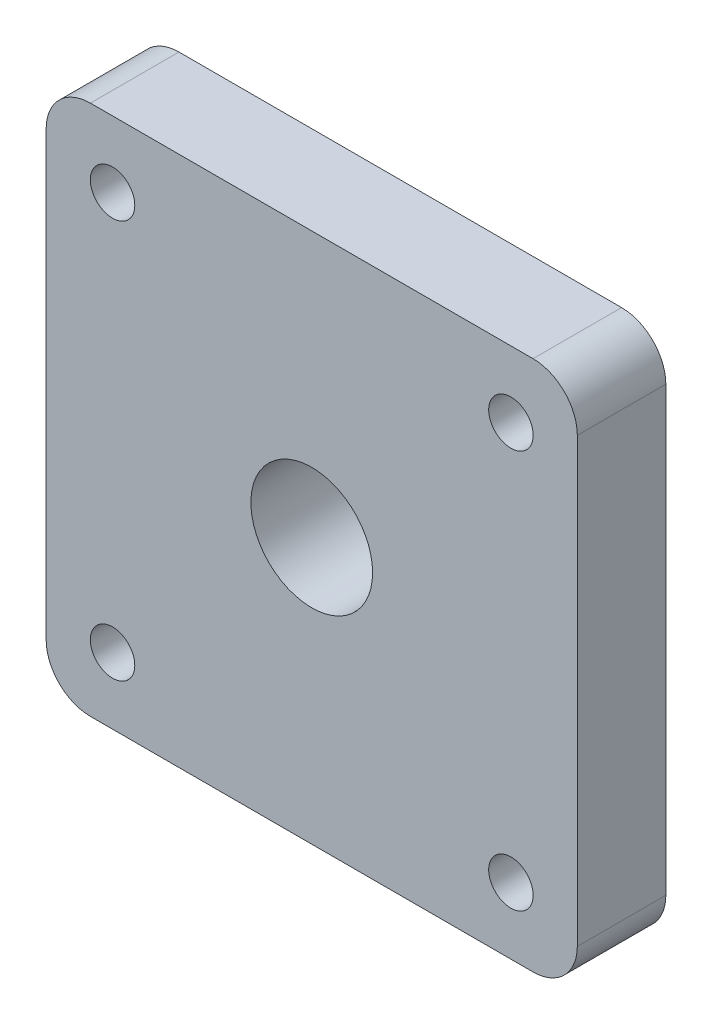
ISO-10303-21;
HEADER;
FILE_DESCRIPTION(('STEP AP214'),'2;1');
FILE_NAME('part.step','',(''),(''),'','','');
FILE_SCHEMA(('AUTOMOTIVE_DESIGN { 1 0 10303 214 1 1 1 1 }'));
ENDSEC;
DATA;
#1=APPLICATION_CONTEXT('core data for automotive mechanical design processes');
#2=APPLICATION_PROTOCOL_DEFINITION('international standard','automotive_design',2000,#1);
#3=PRODUCT_CONTEXT('',#1,'mechanical');
#4=PRODUCT('Part','Part','',(#3));
#5=PRODUCT_RELATED_PRODUCT_CATEGORY('part','',(#4));
#6=PRODUCT_DEFINITION_FORMATION('','',#4);
#7=PRODUCT_DEFINITION_CONTEXT('part definition',#1,'design');
#8=PRODUCT_DEFINITION('design','',#6,#7);
#9=PRODUCT_DEFINITION_SHAPE('','',#8);
#10=(LENGTH_UNIT() NAMED_UNIT(*) SI_UNIT(.MILLI.,.METRE.));
#11=(NAMED_UNIT(*) PLANE_ANGLE_UNIT() SI_UNIT($,.RADIAN.));
#12=(NAMED_UNIT(*) SI_UNIT($,.STERADIAN.) SOLID_ANGLE_UNIT());
#13=UNCERTAINTY_MEASURE_WITH_UNIT(LENGTH_MEASURE(1.E-05),#10,'distance_accuracy_value','');
#14=(GEOMETRIC_REPRESENTATION_CONTEXT(3) GLOBAL_UNCERTAINTY_ASSIGNED_CONTEXT((#13)) GLOBAL_UNIT_ASSIGNED_CONTEXT((#10,
#11,#12)) REPRESENTATION_CONTEXT('',''));
#15=CARTESIAN_POINT('',(0.,0.,0.));
#16=DIRECTION('',(0.,0.,1.));
#17=DIRECTION('',(1.,0.,0.));
#18=AXIS2_PLACEMENT_3D('',#15,#16,#17);
#19=CARTESIAN_POINT('',(-20.955,-20.955,10.541));
#20=DIRECTION('',(0.,0.,1.));
#21=DIRECTION('',(1.,0.,0.));
#22=AXIS2_PLACEMENT_3D('',#19,#20,#21);
#23=PLANE('',#22);
#24=CARTESIAN_POINT('',(18.8595,-18.8595,10.541));
#25=DIRECTION('',(0.,0.,1.));
#26=DIRECTION('',(1.,0.,0.));
#27=AXIS2_PLACEMENT_3D('',#24,#25,#26);
#28=CIRCLE('',#27,2.103882);
#29=CARTESIAN_POINT('',(20.963382,-18.8595,10.541));
#30=VERTEX_POINT('',#29);
#31=EDGE_CURVE('E228',#30,#30,#28,.T.);
#32=ORIENTED_EDGE('',*,*,#31,.F.);
#33=EDGE_LOOP('',(#32));
#34=FACE_BOUND('',#33,.T.);
#35=CARTESIAN_POINT('',(-18.8595,18.8595,10.541));
#36=DIRECTION('',(0.,0.,1.));
#37=DIRECTION('',(1.,0.,0.));
#38=AXIS2_PLACEMENT_3D('',#35,#36,#37);
#39=CIRCLE('',#38,2.103882);
#40=CARTESIAN_POINT('',(-16.755618,18.8595,10.541));
#41=VERTEX_POINT('',#40);
#42=EDGE_CURVE('E212',#41,#41,#39,.T.);
#43=ORIENTED_EDGE('',*,*,#42,.F.);
#44=EDGE_LOOP('',(#43));
#45=FACE_BOUND('',#44,.T.);
#46=CARTESIAN_POINT('',(-20.955,-20.955,10.541));
#47=DIRECTION('',(0.,0.,1.));
#48=DIRECTION('',(1.,0.,0.));
#49=AXIS2_PLACEMENT_3D('',#46,#47,#48);
#50=CIRCLE('',#49,4.191);
#51=CARTESIAN_POINT('',(-25.146,-20.955,10.541));
#52=VERTEX_POINT('',#51);
#53=CARTESIAN_POINT('',(-20.955,-25.146,10.541));
#54=VERTEX_POINT('',#53);
#55=EDGE_CURVE('E163',#52,#54,#50,.T.);
#56=ORIENTED_EDGE('',*,*,#55,.T.);
#57=DIRECTION('',(1.,0.,0.));
#58=VECTOR('',#57,1.);
#59=CARTESIAN_POINT('',(-20.955,-25.146,10.541));
#60=LINE('',#59,#58);
#61=CARTESIAN_POINT('',(20.955,-25.146,10.541));
#62=VERTEX_POINT('',#61);
#63=EDGE_CURVE('E99',#54,#62,#60,.T.);
#64=ORIENTED_EDGE('',*,*,#63,.T.);
#65=CARTESIAN_POINT('',(20.955,-20.955,10.541));
#66=DIRECTION('',(0.,0.,1.));
#67=DIRECTION('',(1.,0.,0.));
#68=AXIS2_PLACEMENT_3D('',#65,#66,#67);
#69=CIRCLE('',#68,4.191);
#70=CARTESIAN_POINT('',(25.146,-20.955,10.541));
#71=VERTEX_POINT('',#70);
#72=EDGE_CURVE('E184',#62,#71,#69,.T.);
#73=ORIENTED_EDGE('',*,*,#72,.T.);
#74=DIRECTION('',(0.,1.,0.));
#75=VECTOR('',#74,1.);
#76=CARTESIAN_POINT('',(25.146,20.955,10.541));
#77=LINE('',#76,#75);
#78=CARTESIAN_POINT('',(25.146,20.955,10.541));
#79=VERTEX_POINT('',#78);
#80=EDGE_CURVE('E198',#71,#79,#77,.T.);
#81=ORIENTED_EDGE('',*,*,#80,.T.);
#82=CARTESIAN_POINT('',(20.955,20.955,10.541));
#83=DIRECTION('',(0.,0.,1.));
#84=DIRECTION('',(-1.,0.,0.));
#85=AXIS2_PLACEMENT_3D('',#82,#83,#84);
#86=CIRCLE('',#85,4.191);
#87=CARTESIAN_POINT('',(20.955,25.146,10.541));
#88=VERTEX_POINT('',#87);
#89=EDGE_CURVE('E118',#79,#88,#86,.T.);
#90=ORIENTED_EDGE('',*,*,#89,.T.);
#91=DIRECTION('',(-1.,0.,0.));
#92=VECTOR('',#91,1.);
#93=CARTESIAN_POINT('',(-20.955,25.146,10.541));
#94=LINE('',#93,#92);
#95=CARTESIAN_POINT('',(-20.955,25.146,10.541));
#96=VERTEX_POINT('',#95);
#97=EDGE_CURVE('E112',#88,#96,#94,.T.);
#98=ORIENTED_EDGE('',*,*,#97,.T.);
#99=CARTESIAN_POINT('',(-20.955,20.955,10.541));
#100=DIRECTION('',(0.,0.,1.));
#101=DIRECTION('',(1.,0.,0.));
#102=AXIS2_PLACEMENT_3D('',#99,#100,#101);
#103=CIRCLE('',#102,4.191);
#104=CARTESIAN_POINT('',(-25.146,20.955,10.541));
#105=VERTEX_POINT('',#104);
#106=EDGE_CURVE('E116',#96,#105,#103,.T.);
#107=ORIENTED_EDGE('',*,*,#106,.T.);
#108=DIRECTION('',(0.,-1.,0.));
#109=VECTOR('',#108,1.);
#110=CARTESIAN_POINT('',(-25.146,20.955,10.541));
#111=LINE('',#110,#109);
#112=EDGE_CURVE('E56',#105,#52,#111,.T.);
#113=ORIENTED_EDGE('',*,*,#112,.T.);
#114=EDGE_LOOP('',(#56,#64,#73,#81,#90,#98,#107,#113));
#115=FACE_BOUND('',#114,.T.);
#116=CARTESIAN_POINT('',(0.,0.,10.541));
#117=DIRECTION('',(0.,0.,1.));
#118=DIRECTION('',(1.,0.,0.));
#119=AXIS2_PLACEMENT_3D('',#116,#117,#118);
#120=CIRCLE('',#119,5.762625);
#121=CARTESIAN_POINT('',(5.762625,0.,10.541));
#122=VERTEX_POINT('',#121);
#123=EDGE_CURVE('E145',#122,#122,#120,.T.);
#124=ORIENTED_EDGE('',*,*,#123,.F.);
#125=EDGE_LOOP('',(#124));
#126=FACE_BOUND('',#125,.T.);
#127=CARTESIAN_POINT('',(18.8595,18.8595,10.541));
#128=DIRECTION('',(0.,0.,1.));
#129=DIRECTION('',(1.,0.,0.));
#130=AXIS2_PLACEMENT_3D('',#127,#128,#129);
#131=CIRCLE('',#130,2.103882);
#132=CARTESIAN_POINT('',(20.963382,18.8595,10.541));
#133=VERTEX_POINT('',#132);
#134=EDGE_CURVE('E220',#133,#133,#131,.T.);
#135=ORIENTED_EDGE('',*,*,#134,.F.);
#136=EDGE_LOOP('',(#135));
#137=FACE_BOUND('',#136,.T.);
#138=CARTESIAN_POINT('',(-18.8595,-18.8595,10.541));
#139=DIRECTION('',(0.,0.,1.));
#140=DIRECTION('',(1.,0.,0.));
#141=AXIS2_PLACEMENT_3D('',#138,#139,#140);
#142=CIRCLE('',#141,2.103882);
#143=CARTESIAN_POINT('',(-16.755618,-18.8595,10.541));
#144=VERTEX_POINT('',#143);
#145=EDGE_CURVE('E236',#144,#144,#142,.T.);
#146=ORIENTED_EDGE('',*,*,#145,.F.);
#147=EDGE_LOOP('',(#146));
#148=FACE_BOUND('',#147,.T.);
#149=ADVANCED_FACE('F38',(#34,#45,#115,#126,#137,#148),#23,.T.);
#150=CARTESIAN_POINT('',(-20.955,-20.955,2.159));
#151=DIRECTION('',(0.,0.,1.));
#152=DIRECTION('',(1.,0.,0.));
#153=AXIS2_PLACEMENT_3D('',#150,#151,#152);
#154=PLANE('',#153);
#155=CARTESIAN_POINT('',(-20.955,-20.955,2.159));
#156=DIRECTION('',(0.,0.,1.));
#157=DIRECTION('',(1.,0.,0.));
#158=AXIS2_PLACEMENT_3D('',#155,#156,#157);
#159=CIRCLE('',#158,4.191);
#160=CARTESIAN_POINT('',(-25.146,-20.955,2.159));
#161=VERTEX_POINT('',#160);
#162=CARTESIAN_POINT('',(-20.955,-25.146,2.159));
#163=VERTEX_POINT('',#162);
#164=EDGE_CURVE('E140',#161,#163,#159,.T.);
#165=ORIENTED_EDGE('',*,*,#164,.F.);
#166=DIRECTION('',(0.,-1.,0.));
#167=VECTOR('',#166,1.);
#168=CARTESIAN_POINT('',(-25.146,20.955,2.159));
#169=LINE('',#168,#167);
#170=CARTESIAN_POINT('',(-25.146,20.955,2.159));
#171=VERTEX_POINT('',#170);
#172=EDGE_CURVE('E91',#171,#161,#169,.T.);
#173=ORIENTED_EDGE('',*,*,#172,.F.);
#174=CARTESIAN_POINT('',(-20.955,20.955,2.159));
#175=DIRECTION('',(0.,0.,1.));
#176=DIRECTION('',(1.,0.,0.));
#177=AXIS2_PLACEMENT_3D('',#174,#175,#176);
#178=CIRCLE('',#177,4.191);
#179=CARTESIAN_POINT('',(-20.955,25.146,2.159));
#180=VERTEX_POINT('',#179);
#181=EDGE_CURVE('E85',#180,#171,#178,.T.);
#182=ORIENTED_EDGE('',*,*,#181,.F.);
#183=DIRECTION('',(-1.,0.,0.));
#184=VECTOR('',#183,1.);
#185=CARTESIAN_POINT('',(-20.955,25.146,2.159));
#186=LINE('',#185,#184);
#187=CARTESIAN_POINT('',(20.955,25.146,2.159));
#188=VERTEX_POINT('',#187);
#189=EDGE_CURVE('E127',#188,#180,#186,.T.);
#190=ORIENTED_EDGE('',*,*,#189,.F.);
#191=CARTESIAN_POINT('',(20.955,20.955,2.159));
#192=DIRECTION('',(0.,0.,1.));
#193=DIRECTION('',(-1.,0.,0.));
#194=AXIS2_PLACEMENT_3D('',#191,#192,#193);
#195=CIRCLE('',#194,4.191);
#196=CARTESIAN_POINT('',(25.146,20.955,2.159));
#197=VERTEX_POINT('',#196);
#198=EDGE_CURVE('E154',#197,#188,#195,.T.);
#199=ORIENTED_EDGE('',*,*,#198,.F.);
#200=DIRECTION('',(0.,1.,0.));
#201=VECTOR('',#200,1.);
#202=CARTESIAN_POINT('',(25.146,20.955,2.159));
#203=LINE('',#202,#201);
#204=CARTESIAN_POINT('',(25.146,-20.955,2.159));
#205=VERTEX_POINT('',#204);
#206=EDGE_CURVE('E151',#205,#197,#203,.T.);
#207=ORIENTED_EDGE('',*,*,#206,.F.);
#208=CARTESIAN_POINT('',(20.955,-20.955,2.159));
#209=DIRECTION('',(0.,0.,1.));
#210=DIRECTION('',(1.,0.,0.));
#211=AXIS2_PLACEMENT_3D('',#208,#209,#210);
#212=CIRCLE('',#211,4.191);
#213=CARTESIAN_POINT('',(20.955,-25.146,2.159));
#214=VERTEX_POINT('',#213);
#215=EDGE_CURVE('E148',#214,#205,#212,.T.);
#216=ORIENTED_EDGE('',*,*,#215,.F.);
#217=DIRECTION('',(1.,0.,0.));
#218=VECTOR('',#217,1.);
#219=CARTESIAN_POINT('',(-20.955,-25.146,2.159));
#220=LINE('',#219,#218);
#221=EDGE_CURVE('E144',#163,#214,#220,.T.);
#222=ORIENTED_EDGE('',*,*,#221,.F.);
#223=EDGE_LOOP('',(#165,#173,#182,#190,#199,#207,#216,#222));
#224=FACE_BOUND('',#223,.T.);
#225=CARTESIAN_POINT('',(0.,0.,2.159));
#226=DIRECTION('',(0.,0.,1.));
#227=DIRECTION('',(1.,0.,0.));
#228=AXIS2_PLACEMENT_3D('',#225,#226,#227);
#229=CIRCLE('',#228,5.762625);
#230=CARTESIAN_POINT('',(5.762625,0.,2.159));
#231=VERTEX_POINT('',#230);
#232=EDGE_CURVE('E208',#231,#231,#229,.T.);
#233=ORIENTED_EDGE('',*,*,#232,.T.);
#234=EDGE_LOOP('',(#233));
#235=FACE_BOUND('',#234,.T.);
#236=CARTESIAN_POINT('',(-18.8595,18.8595,2.159));
#237=DIRECTION('',(0.,0.,1.));
#238=DIRECTION('',(1.,0.,0.));
#239=AXIS2_PLACEMENT_3D('',#236,#237,#238);
#240=CIRCLE('',#239,2.103882);
#241=CARTESIAN_POINT('',(-16.755618,18.8595,2.159));
#242=VERTEX_POINT('',#241);
#243=EDGE_CURVE('E216',#242,#242,#240,.T.);
#244=ORIENTED_EDGE('',*,*,#243,.T.);
#245=EDGE_LOOP('',(#244));
#246=FACE_BOUND('',#245,.T.);
#247=CARTESIAN_POINT('',(18.8595,18.8595,2.159));
#248=DIRECTION('',(0.,0.,1.));
#249=DIRECTION('',(1.,0.,0.));
#250=AXIS2_PLACEMENT_3D('',#247,#248,#249);
#251=CIRCLE('',#250,2.103882);
#252=CARTESIAN_POINT('',(20.963382,18.8595,2.159));
#253=VERTEX_POINT('',#252);
#254=EDGE_CURVE('E224',#253,#253,#251,.T.);
#255=ORIENTED_EDGE('',*,*,#254,.T.);
#256=EDGE_LOOP('',(#255));
#257=FACE_BOUND('',#256,.T.);
#258=CARTESIAN_POINT('',(18.8595,-18.8595,2.159));
#259=DIRECTION('',(0.,0.,1.));
#260=DIRECTION('',(1.,0.,0.));
#261=AXIS2_PLACEMENT_3D('',#258,#259,#260);
#262=CIRCLE('',#261,2.103882);
#263=CARTESIAN_POINT('',(20.963382,-18.8595,2.159));
#264=VERTEX_POINT('',#263);
#265=EDGE_CURVE('E232',#264,#264,#262,.T.);
#266=ORIENTED_EDGE('',*,*,#265,.T.);
#267=EDGE_LOOP('',(#266));
#268=FACE_BOUND('',#267,.T.);
#269=CARTESIAN_POINT('',(-18.8595,-18.8595,2.159));
#270=DIRECTION('',(0.,0.,1.));
#271=DIRECTION('',(1.,0.,0.));
#272=AXIS2_PLACEMENT_3D('',#269,#270,#271);
#273=CIRCLE('',#272,2.103882);
#274=CARTESIAN_POINT('',(-16.755618,-18.8595,2.159));
#275=VERTEX_POINT('',#274);
#276=EDGE_CURVE('E240',#275,#275,#273,.T.);
#277=ORIENTED_EDGE('',*,*,#276,.T.);
#278=EDGE_LOOP('',(#277));
#279=FACE_BOUND('',#278,.T.);
#280=ADVANCED_FACE('F188',(#224,#235,#246,#257,#268,#279),#154,.F.);
#281=CARTESIAN_POINT('',(-20.955,-20.955,10.541));
#282=DIRECTION('',(0.,0.,-1.));
#283=DIRECTION('',(-1.,0.,0.));
#284=AXIS2_PLACEMENT_3D('',#281,#282,#283);
#285=CYLINDRICAL_SURFACE('',#284,4.191);
#286=ORIENTED_EDGE('',*,*,#164,.T.);
#287=DIRECTION('',(0.,0.,-1.));
#288=VECTOR('',#287,1.);
#289=CARTESIAN_POINT('',(-20.955,-25.146,10.541));
#290=LINE('',#289,#288);
#291=EDGE_CURVE('E11',#54,#163,#290,.T.);
#292=ORIENTED_EDGE('',*,*,#291,.F.);
#293=ORIENTED_EDGE('',*,*,#55,.F.);
#294=DIRECTION('',(0.,0.,-1.));
#295=VECTOR('',#294,1.);
#296=CARTESIAN_POINT('',(-25.146,-20.955,10.541));
#297=LINE('',#296,#295);
#298=EDGE_CURVE('E136',#52,#161,#297,.T.);
#299=ORIENTED_EDGE('',*,*,#298,.T.);
#300=EDGE_LOOP('',(#286,#292,#293,#299));
#301=FACE_BOUND('',#300,.T.);
#302=ADVANCED_FACE('F40',(#301),#285,.T.);
#303=CARTESIAN_POINT('',(-20.955,-25.146,10.541));
#304=DIRECTION('',(0.,1.,0.));
#305=DIRECTION('',(0.,0.,1.));
#306=AXIS2_PLACEMENT_3D('',#303,#304,#305);
#307=PLANE('',#306);
#308=ORIENTED_EDGE('',*,*,#221,.T.);
#309=DIRECTION('',(0.,0.,-1.));
#310=VECTOR('',#309,1.);
#311=CARTESIAN_POINT('',(20.955,-25.146,10.541));
#312=LINE('',#311,#310);
#313=EDGE_CURVE('E48',#62,#214,#312,.T.);
#314=ORIENTED_EDGE('',*,*,#313,.F.);
#315=ORIENTED_EDGE('',*,*,#63,.F.);
#316=ORIENTED_EDGE('',*,*,#291,.T.);
#317=EDGE_LOOP('',(#308,#314,#315,#316));
#318=FACE_BOUND('',#317,.T.);
#319=ADVANCED_FACE('F276',(#318),#307,.F.);
#320=CARTESIAN_POINT('',(20.955,-20.955,10.541));
#321=DIRECTION('',(0.,0.,-1.));
#322=DIRECTION('',(-1.,0.,0.));
#323=AXIS2_PLACEMENT_3D('',#320,#321,#322);
#324=CYLINDRICAL_SURFACE('',#323,4.191);
#325=ORIENTED_EDGE('',*,*,#215,.T.);
#326=DIRECTION('',(0.,0.,-1.));
#327=VECTOR('',#326,1.);
#328=CARTESIAN_POINT('',(25.146,-20.955,10.541));
#329=LINE('',#328,#327);
#330=EDGE_CURVE('E174',#71,#205,#329,.T.);
#331=ORIENTED_EDGE('',*,*,#330,.F.);
#332=ORIENTED_EDGE('',*,*,#72,.F.);
#333=ORIENTED_EDGE('',*,*,#313,.T.);
#334=EDGE_LOOP('',(#325,#331,#332,#333));
#335=FACE_BOUND('',#334,.T.);
#336=ADVANCED_FACE('F182',(#335),#324,.T.);
#337=CARTESIAN_POINT('',(25.146,20.955,10.541));
#338=DIRECTION('',(-1.,0.,0.));
#339=DIRECTION('',(0.,0.,1.));
#340=AXIS2_PLACEMENT_3D('',#337,#338,#339);
#341=PLANE('',#340);
#342=ORIENTED_EDGE('',*,*,#206,.T.);
#343=DIRECTION('',(0.,0.,-1.));
#344=VECTOR('',#343,1.);
#345=CARTESIAN_POINT('',(25.146,20.955,10.541));
#346=LINE('',#345,#344);
#347=EDGE_CURVE('E170',#79,#197,#346,.T.);
#348=ORIENTED_EDGE('',*,*,#347,.F.);
#349=ORIENTED_EDGE('',*,*,#80,.F.);
#350=ORIENTED_EDGE('',*,*,#330,.T.);
#351=EDGE_LOOP('',(#342,#348,#349,#350));
#352=FACE_BOUND('',#351,.T.);
#353=ADVANCED_FACE('F193',(#352),#341,.F.);
#354=CARTESIAN_POINT('',(20.955,20.955,10.541));
#355=DIRECTION('',(0.,0.,-1.));
#356=DIRECTION('',(-1.,0.,0.));
#357=AXIS2_PLACEMENT_3D('',#354,#355,#356);
#358=CYLINDRICAL_SURFACE('',#357,4.191);
#359=ORIENTED_EDGE('',*,*,#198,.T.);
#360=DIRECTION('',(0.,0.,-1.));
#361=VECTOR('',#360,1.);
#362=CARTESIAN_POINT('',(20.955,25.146,10.541));
#363=LINE('',#362,#361);
#364=EDGE_CURVE('E129',#88,#188,#363,.T.);
#365=ORIENTED_EDGE('',*,*,#364,.F.);
#366=ORIENTED_EDGE('',*,*,#89,.F.);
#367=ORIENTED_EDGE('',*,*,#347,.T.);
#368=EDGE_LOOP('',(#359,#365,#366,#367));
#369=FACE_BOUND('',#368,.T.);
#370=ADVANCED_FACE('F196',(#369),#358,.T.);
#371=CARTESIAN_POINT('',(-20.955,25.146,10.541));
#372=DIRECTION('',(0.,-1.,0.));
#373=DIRECTION('',(0.,0.,-1.));
#374=AXIS2_PLACEMENT_3D('',#371,#372,#373);
#375=PLANE('',#374);
#376=ORIENTED_EDGE('',*,*,#189,.T.);
#377=DIRECTION('',(0.,0.,-1.));
#378=VECTOR('',#377,1.);
#379=CARTESIAN_POINT('',(-20.955,25.146,10.541));
#380=LINE('',#379,#378);
#381=EDGE_CURVE('E124',#96,#180,#380,.T.);
#382=ORIENTED_EDGE('',*,*,#381,.F.);
#383=ORIENTED_EDGE('',*,*,#97,.F.);
#384=ORIENTED_EDGE('',*,*,#364,.T.);
#385=EDGE_LOOP('',(#376,#382,#383,#384));
#386=FACE_BOUND('',#385,.T.);
#387=ADVANCED_FACE('F125',(#386),#375,.F.);
#388=CARTESIAN_POINT('',(-20.955,20.955,10.541));
#389=DIRECTION('',(0.,0.,-1.));
#390=DIRECTION('',(-1.,0.,0.));
#391=AXIS2_PLACEMENT_3D('',#388,#389,#390);
#392=CYLINDRICAL_SURFACE('',#391,4.191);
#393=ORIENTED_EDGE('',*,*,#181,.T.);
#394=DIRECTION('',(0.,0.,-1.));
#395=VECTOR('',#394,1.);
#396=CARTESIAN_POINT('',(-25.146,20.955,10.541));
#397=LINE('',#396,#395);
#398=EDGE_CURVE('E130',#105,#171,#397,.T.);
#399=ORIENTED_EDGE('',*,*,#398,.F.);
#400=ORIENTED_EDGE('',*,*,#106,.F.);
#401=ORIENTED_EDGE('',*,*,#381,.T.);
#402=EDGE_LOOP('',(#393,#399,#400,#401));
#403=FACE_BOUND('',#402,.T.);
#404=ADVANCED_FACE('F132',(#403),#392,.T.);
#405=CARTESIAN_POINT('',(-25.146,20.955,10.541));
#406=DIRECTION('',(1.,0.,0.));
#407=DIRECTION('',(0.,0.,-1.));
#408=AXIS2_PLACEMENT_3D('',#405,#406,#407);
#409=PLANE('',#408);
#410=ORIENTED_EDGE('',*,*,#172,.T.);
#411=ORIENTED_EDGE('',*,*,#298,.F.);
#412=ORIENTED_EDGE('',*,*,#112,.F.);
#413=ORIENTED_EDGE('',*,*,#398,.T.);
#414=EDGE_LOOP('',(#410,#411,#412,#413));
#415=FACE_BOUND('',#414,.T.);
#416=ADVANCED_FACE('F264',(#415),#409,.F.);
#417=CARTESIAN_POINT('',(0.,0.,10.541));
#418=DIRECTION('',(0.,0.,-1.));
#419=DIRECTION('',(-1.,0.,0.));
#420=AXIS2_PLACEMENT_3D('',#417,#418,#419);
#421=CYLINDRICAL_SURFACE('',#420,5.762625);
#422=ORIENTED_EDGE('',*,*,#123,.T.);
#423=EDGE_LOOP('',(#422));
#424=FACE_BOUND('',#423,.T.);
#425=ORIENTED_EDGE('',*,*,#232,.F.);
#426=EDGE_LOOP('',(#425));
#427=FACE_BOUND('',#426,.T.);
#428=ADVANCED_FACE('F261',(#424,#427),#421,.F.);
#429=CARTESIAN_POINT('',(-18.8595,18.8595,10.541));
#430=DIRECTION('',(0.,0.,-1.));
#431=DIRECTION('',(-1.,0.,0.));
#432=AXIS2_PLACEMENT_3D('',#429,#430,#431);
#433=CYLINDRICAL_SURFACE('',#432,2.103882);
#434=ORIENTED_EDGE('',*,*,#42,.T.);
#435=EDGE_LOOP('',(#434));
#436=FACE_BOUND('',#435,.T.);
#437=ORIENTED_EDGE('',*,*,#243,.F.);
#438=EDGE_LOOP('',(#437));
#439=FACE_BOUND('',#438,.T.);
#440=ADVANCED_FACE('F340',(#436,#439),#433,.F.);
#441=CARTESIAN_POINT('',(18.8595,18.8595,10.541));
#442=DIRECTION('',(0.,0.,-1.));
#443=DIRECTION('',(-1.,0.,0.));
#444=AXIS2_PLACEMENT_3D('',#441,#442,#443);
#445=CYLINDRICAL_SURFACE('',#444,2.103882);
#446=ORIENTED_EDGE('',*,*,#134,.T.);
#447=EDGE_LOOP('',(#446));
#448=FACE_BOUND('',#447,.T.);
#449=ORIENTED_EDGE('',*,*,#254,.F.);
#450=EDGE_LOOP('',(#449));
#451=FACE_BOUND('',#450,.T.);
#452=ADVANCED_FACE('F348',(#448,#451),#445,.F.);
#453=CARTESIAN_POINT('',(18.8595,-18.8595,10.541));
#454=DIRECTION('',(0.,0.,-1.));
#455=DIRECTION('',(-1.,0.,0.));
#456=AXIS2_PLACEMENT_3D('',#453,#454,#455);
#457=CYLINDRICAL_SURFACE('',#456,2.103882);
#458=ORIENTED_EDGE('',*,*,#31,.T.);
#459=EDGE_LOOP('',(#458));
#460=FACE_BOUND('',#459,.T.);
#461=ORIENTED_EDGE('',*,*,#265,.F.);
#462=EDGE_LOOP('',(#461));
#463=FACE_BOUND('',#462,.T.);
#464=ADVANCED_FACE('F356',(#460,#463),#457,.F.);
#465=CARTESIAN_POINT('',(-18.8595,-18.8595,10.541));
#466=DIRECTION('',(0.,0.,-1.));
#467=DIRECTION('',(-1.,0.,0.));
#468=AXIS2_PLACEMENT_3D('',#465,#466,#467);
#469=CYLINDRICAL_SURFACE('',#468,2.103882);
#470=ORIENTED_EDGE('',*,*,#145,.T.);
#471=EDGE_LOOP('',(#470));
#472=FACE_BOUND('',#471,.T.);
#473=ORIENTED_EDGE('',*,*,#276,.F.);
#474=EDGE_LOOP('',(#473));
#475=FACE_BOUND('',#474,.T.);
#476=ADVANCED_FACE('F248',(#472,#475),#469,.F.);
#477=CLOSED_SHELL('',(#149,#280,#302,#319,#336,#353,#370,#387,#404,#416,#428,#440,#452,#464,#476));
#478=MANIFOLD_SOLID_BREP('B2',#477);
#479=ADVANCED_BREP_SHAPE_REPRESENTATION('',(#18,#478),#14);
#480=SHAPE_DEFINITION_REPRESENTATION(#9,#479);
ENDSEC;
END-ISO-10303-21;
